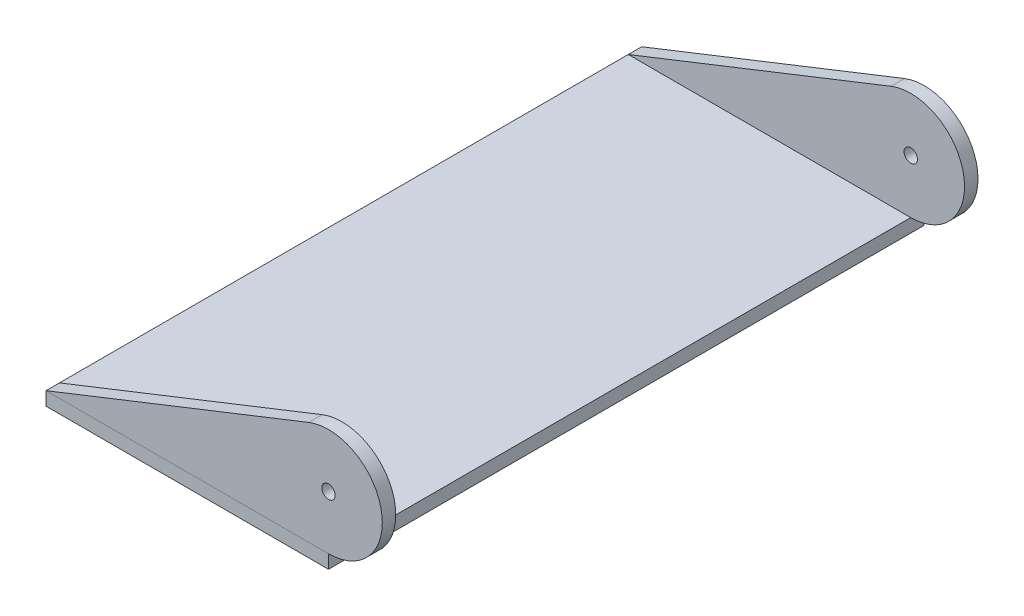
ISO-10303-21;
HEADER;
FILE_DESCRIPTION(('STEP AP214'),'2;1');
FILE_NAME('part.step','',(''),(''),'','','');
FILE_SCHEMA(('AUTOMOTIVE_DESIGN { 1 0 10303 214 1 1 1 1 }'));
ENDSEC;
DATA;
#1=APPLICATION_CONTEXT('core data for automotive mechanical design processes');
#2=APPLICATION_PROTOCOL_DEFINITION('international standard','automotive_design',2000,#1);
#3=PRODUCT_CONTEXT('',#1,'mechanical');
#4=PRODUCT('Part','Part','',(#3));
#5=PRODUCT_RELATED_PRODUCT_CATEGORY('part','',(#4));
#6=PRODUCT_DEFINITION_FORMATION('','',#4);
#7=PRODUCT_DEFINITION_CONTEXT('part definition',#1,'design');
#8=PRODUCT_DEFINITION('design','',#6,#7);
#9=PRODUCT_DEFINITION_SHAPE('','',#8);
#10=(LENGTH_UNIT() NAMED_UNIT(*) SI_UNIT(.MILLI.,.METRE.));
#11=(NAMED_UNIT(*) PLANE_ANGLE_UNIT() SI_UNIT($,.RADIAN.));
#12=(NAMED_UNIT(*) SI_UNIT($,.STERADIAN.) SOLID_ANGLE_UNIT());
#13=UNCERTAINTY_MEASURE_WITH_UNIT(LENGTH_MEASURE(1.E-05),#10,'distance_accuracy_value','');
#14=(GEOMETRIC_REPRESENTATION_CONTEXT(3) GLOBAL_UNCERTAINTY_ASSIGNED_CONTEXT((#13)) GLOBAL_UNIT_ASSIGNED_CONTEXT((#10,
#11,#12)) REPRESENTATION_CONTEXT('',''));
#15=CARTESIAN_POINT('',(0.,0.,0.));
#16=DIRECTION('',(0.,0.,1.));
#17=DIRECTION('',(1.,0.,0.));
#18=AXIS2_PLACEMENT_3D('',#15,#16,#17);
#19=CARTESIAN_POINT('',(0.,1.5875,-42.1947603330405));
#20=DIRECTION('',(0.,1.,0.));
#21=DIRECTION('',(0.,0.,1.));
#22=AXIS2_PLACEMENT_3D('',#19,#20,#21);
#23=PLANE('',#22);
#24=DIRECTION('',(0.,0.,1.));
#25=VECTOR('',#24,1.);
#26=CARTESIAN_POINT('',(32.9217251712329,1.5875,-42.1947603330405));
#27=LINE('',#26,#25);
#28=CARTESIAN_POINT('',(32.9217251712329,1.5875,-0.524775256849318));
#29=VERTEX_POINT('',#28);
#30=CARTESIAN_POINT('',(32.9217251712329,1.5875,1.06272474315068));
#31=VERTEX_POINT('',#30);
#32=EDGE_CURVE('E50',#29,#31,#27,.T.);
#33=ORIENTED_EDGE('',*,*,#32,.T.);
#34=DIRECTION('',(-1.,0.,0.));
#35=VECTOR('',#34,1.);
#36=CARTESIAN_POINT('',(39.2717251712329,1.5875,1.06272474315068));
#37=LINE('',#36,#35);
#38=CARTESIAN_POINT('',(-0.415774828767123,1.5875,1.06272474315068));
#39=VERTEX_POINT('',#38);
#40=EDGE_CURVE('E97',#31,#39,#37,.T.);
#41=ORIENTED_EDGE('',*,*,#40,.T.);
#42=DIRECTION('',(0.,0.,1.));
#43=VECTOR('',#42,1.);
#44=CARTESIAN_POINT('',(-0.415774828767123,1.5875,-42.1947603330405));
#45=LINE('',#44,#43);
#46=CARTESIAN_POINT('',(-0.415774828767123,1.5875,-0.524775256849318));
#47=VERTEX_POINT('',#46);
#48=EDGE_CURVE('E93',#47,#39,#45,.T.);
#49=ORIENTED_EDGE('',*,*,#48,.F.);
#50=DIRECTION('',(-1.,0.,0.));
#51=VECTOR('',#50,1.);
#52=CARTESIAN_POINT('',(0.,1.5875,-0.524775256849318));
#53=LINE('',#52,#51);
#54=EDGE_CURVE('E81',#29,#47,#53,.T.);
#55=ORIENTED_EDGE('',*,*,#54,.F.);
#56=EDGE_LOOP('',(#33,#41,#49,#55));
#57=FACE_BOUND('',#56,.T.);
#58=ADVANCED_FACE('F46',(#57),#23,.F.);
#59=CARTESIAN_POINT('',(-0.59891274924526,1.51510665731688,-42.1947603330405));
#60=DIRECTION('',(0.367614879649891,-0.929978118161926,0.));
#61=DIRECTION('',(0.929978118161926,0.367614879649891,0.));
#62=AXIS2_PLACEMENT_3D('',#59,#60,#61);
#63=PLANE('',#62);
#64=ORIENTED_EDGE('',*,*,#48,.T.);
#65=DIRECTION('',(0.929978118161926,0.367614879649891,0.));
#66=VECTOR('',#65,1.);
#67=CARTESIAN_POINT('',(-0.598912749245261,1.51510665731688,1.06272474315068));
#68=LINE('',#67,#66);
#69=CARTESIAN_POINT('',(30.5873706854561,13.8428610503282,1.06272474315068));
#70=VERTEX_POINT('',#69);
#71=EDGE_CURVE('E62',#39,#70,#68,.T.);
#72=ORIENTED_EDGE('',*,*,#71,.T.);
#73=DIRECTION('',(0.,0.,1.));
#74=VECTOR('',#73,1.);
#75=CARTESIAN_POINT('',(30.5873706854561,13.8428610503282,-42.1947603330405));
#76=LINE('',#75,#74);
#77=CARTESIAN_POINT('',(30.5873706854561,13.8428610503282,-0.524775256849318));
#78=VERTEX_POINT('',#77);
#79=EDGE_CURVE('E88',#78,#70,#76,.T.);
#80=ORIENTED_EDGE('',*,*,#79,.F.);
#81=DIRECTION('',(0.929978118161926,0.367614879649891,0.));
#82=VECTOR('',#81,1.);
#83=CARTESIAN_POINT('',(-0.59891274924526,1.51510665731688,-0.524775256849318));
#84=LINE('',#83,#82);
#85=EDGE_CURVE('E55',#47,#78,#84,.T.);
#86=ORIENTED_EDGE('',*,*,#85,.F.);
#87=EDGE_LOOP('',(#64,#72,#80,#86));
#88=FACE_BOUND('',#87,.T.);
#89=ADVANCED_FACE('F110',(#88),#63,.F.);
#90=CARTESIAN_POINT('',(32.9217251712329,7.9375,-42.1947603330405));
#91=DIRECTION('',(0.,0.,1.));
#92=DIRECTION('',(1.,0.,0.));
#93=AXIS2_PLACEMENT_3D('',#90,#91,#92);
#94=CYLINDRICAL_SURFACE('',#93,6.35);
#95=CARTESIAN_POINT('',(32.9217251712329,7.9375,1.06272474315068));
#96=DIRECTION('',(0.,0.,-1.));
#97=DIRECTION('',(0.,1.,0.));
#98=AXIS2_PLACEMENT_3D('',#95,#96,#97);
#99=CIRCLE('',#98,6.35);
#100=EDGE_CURVE('E12',#31,#70,#99,.F.);
#101=ORIENTED_EDGE('',*,*,#100,.F.);
#102=ORIENTED_EDGE('',*,*,#32,.F.);
#103=CARTESIAN_POINT('',(32.9217251712329,7.9375,-0.524775256849318));
#104=DIRECTION('',(0.,0.,-1.));
#105=DIRECTION('',(-1.,0.,0.));
#106=AXIS2_PLACEMENT_3D('',#103,#104,#105);
#107=CIRCLE('',#106,6.35);
#108=EDGE_CURVE('E78',#29,#78,#107,.F.);
#109=ORIENTED_EDGE('',*,*,#108,.T.);
#110=ORIENTED_EDGE('',*,*,#79,.T.);
#111=EDGE_LOOP('',(#101,#102,#109,#110));
#112=FACE_BOUND('',#111,.T.);
#113=ADVANCED_FACE('F96',(#112),#94,.T.);
#114=CARTESIAN_POINT('',(32.9217251712329,7.9375,-42.1947603330405));
#115=DIRECTION('',(0.,0.,1.));
#116=DIRECTION('',(1.,0.,0.));
#117=AXIS2_PLACEMENT_3D('',#114,#115,#116);
#118=CYLINDRICAL_SURFACE('',#117,0.79375);
#119=CARTESIAN_POINT('',(32.9217251712329,7.9375,1.06272474315068));
#120=DIRECTION('',(0.,0.,-1.));
#121=DIRECTION('',(0.,1.,0.));
#122=AXIS2_PLACEMENT_3D('',#119,#120,#121);
#123=CIRCLE('',#122,0.79375);
#124=CARTESIAN_POINT('',(32.9217251712329,8.73125,1.06272474315068));
#125=VERTEX_POINT('',#124);
#126=EDGE_CURVE('E101',#125,#125,#123,.F.);
#127=ORIENTED_EDGE('',*,*,#126,.T.);
#128=EDGE_LOOP('',(#127));
#129=FACE_BOUND('',#128,.T.);
#130=CARTESIAN_POINT('',(32.9217251712329,7.9375,-0.524775256849318));
#131=DIRECTION('',(0.,0.,-1.));
#132=DIRECTION('',(-1.,0.,0.));
#133=AXIS2_PLACEMENT_3D('',#130,#131,#132);
#134=CIRCLE('',#133,0.79375);
#135=CARTESIAN_POINT('',(32.1279751712329,7.9375,-0.524775256849318));
#136=VERTEX_POINT('',#135);
#137=EDGE_CURVE('E94',#136,#136,#134,.F.);
#138=ORIENTED_EDGE('',*,*,#137,.F.);
#139=EDGE_LOOP('',(#138));
#140=FACE_BOUND('',#139,.T.);
#141=ADVANCED_FACE('F48',(#129,#140),#118,.F.);
#142=CARTESIAN_POINT('',(-0.415774828767123,1.5875,-0.524775256849315));
#143=DIRECTION('',(0.,0.,-1.));
#144=DIRECTION('',(-1.,0.,0.));
#145=AXIS2_PLACEMENT_3D('',#142,#143,#144);
#146=PLANE('',#145);
#147=ORIENTED_EDGE('',*,*,#137,.T.);
#148=EDGE_LOOP('',(#147));
#149=FACE_BOUND('',#148,.T.);
#150=ORIENTED_EDGE('',*,*,#108,.F.);
#151=ORIENTED_EDGE('',*,*,#54,.T.);
#152=ORIENTED_EDGE('',*,*,#85,.T.);
#153=EDGE_LOOP('',(#150,#151,#152));
#154=FACE_BOUND('',#153,.T.);
#155=ADVANCED_FACE('F80',(#149,#154),#146,.T.);
#156=CARTESIAN_POINT('',(39.2717251712329,1.5875,1.06272474315068));
#157=DIRECTION('',(0.,0.,-1.));
#158=DIRECTION('',(0.,1.,0.));
#159=AXIS2_PLACEMENT_3D('',#156,#157,#158);
#160=PLANE('',#159);
#161=ORIENTED_EDGE('',*,*,#126,.F.);
#162=EDGE_LOOP('',(#161));
#163=FACE_BOUND('',#162,.T.);
#164=ORIENTED_EDGE('',*,*,#40,.F.);
#165=ORIENTED_EDGE('',*,*,#100,.T.);
#166=ORIENTED_EDGE('',*,*,#71,.F.);
#167=EDGE_LOOP('',(#164,#165,#166));
#168=FACE_BOUND('',#167,.T.);
#169=ADVANCED_FACE('F119',(#163,#168),#160,.F.);
#170=CLOSED_SHELL('',(#58,#89,#113,#141,#155,#169));
#171=MANIFOLD_SOLID_BREP('B2',#170);
#172=CARTESIAN_POINT('',(32.9217251712329,7.9375,-42.1947603330405));
#173=DIRECTION('',(0.,0.,1.));
#174=DIRECTION('',(1.,0.,0.));
#175=AXIS2_PLACEMENT_3D('',#172,#173,#174);
#176=CYLINDRICAL_SURFACE('',#175,6.35);
#177=CARTESIAN_POINT('',(32.9217251712329,7.9375,68.1877247431507));
#178=DIRECTION('',(0.,0.,1.));
#179=DIRECTION('',(1.,0.,0.));
#180=AXIS2_PLACEMENT_3D('',#177,#178,#179);
#181=CIRCLE('',#180,6.35);
#182=CARTESIAN_POINT('',(30.5873706854561,13.8428610503282,68.1877247431507));
#183=VERTEX_POINT('',#182);
#184=CARTESIAN_POINT('',(32.9217251712329,1.5875,68.1877247431507));
#185=VERTEX_POINT('',#184);
#186=EDGE_CURVE('E214',#183,#185,#181,.F.);
#187=ORIENTED_EDGE('',*,*,#186,.F.);
#188=DIRECTION('',(0.,0.,1.));
#189=VECTOR('',#188,1.);
#190=CARTESIAN_POINT('',(30.5873706854561,13.8428610503282,-42.1947603330405));
#191=LINE('',#190,#189);
#192=CARTESIAN_POINT('',(30.5873706854561,13.8428610503282,69.7752247431507));
#193=VERTEX_POINT('',#192);
#194=EDGE_CURVE('E195',#183,#193,#191,.T.);
#195=ORIENTED_EDGE('',*,*,#194,.T.);
#196=CARTESIAN_POINT('',(32.9217251712329,7.9375,69.7752247431507));
#197=DIRECTION('',(0.,0.,1.));
#198=DIRECTION('',(1.,0.,0.));
#199=AXIS2_PLACEMENT_3D('',#196,#197,#198);
#200=CIRCLE('',#199,6.35);
#201=CARTESIAN_POINT('',(32.9217251712329,1.5875,69.7752247431507));
#202=VERTEX_POINT('',#201);
#203=EDGE_CURVE('E44',#202,#193,#200,.T.);
#204=ORIENTED_EDGE('',*,*,#203,.F.);
#205=DIRECTION('',(0.,0.,1.));
#206=VECTOR('',#205,1.);
#207=CARTESIAN_POINT('',(32.9217251712329,1.5875,-42.1947603330405));
#208=LINE('',#207,#206);
#209=EDGE_CURVE('E224',#185,#202,#208,.T.);
#210=ORIENTED_EDGE('',*,*,#209,.F.);
#211=EDGE_LOOP('',(#187,#195,#204,#210));
#212=FACE_BOUND('',#211,.T.);
#213=ADVANCED_FACE('F177',(#212),#176,.T.);
#214=CARTESIAN_POINT('',(-0.59891274924526,1.51510665731688,-42.1947603330405));
#215=DIRECTION('',(0.367614879649891,-0.929978118161926,0.));
#216=DIRECTION('',(0.929978118161926,0.367614879649891,0.));
#217=AXIS2_PLACEMENT_3D('',#214,#215,#216);
#218=PLANE('',#217);
#219=ORIENTED_EDGE('',*,*,#194,.F.);
#220=DIRECTION('',(-0.929978118161926,-0.367614879649891,0.));
#221=VECTOR('',#220,1.);
#222=CARTESIAN_POINT('',(-0.59891274924526,1.51510665731688,68.1877247431507));
#223=LINE('',#222,#221);
#224=CARTESIAN_POINT('',(-0.415774828767123,1.5875,68.1877247431507));
#225=VERTEX_POINT('',#224);
#226=EDGE_CURVE('E213',#183,#225,#223,.T.);
#227=ORIENTED_EDGE('',*,*,#226,.T.);
#228=DIRECTION('',(0.,0.,1.));
#229=VECTOR('',#228,1.);
#230=CARTESIAN_POINT('',(-0.415774828767123,1.5875,-42.1947603330405));
#231=LINE('',#230,#229);
#232=CARTESIAN_POINT('',(-0.415774828767123,1.5875,69.7752247431507));
#233=VERTEX_POINT('',#232);
#234=EDGE_CURVE('E222',#225,#233,#231,.T.);
#235=ORIENTED_EDGE('',*,*,#234,.T.);
#236=DIRECTION('',(0.929978118161926,0.367614879649891,0.));
#237=VECTOR('',#236,1.);
#238=CARTESIAN_POINT('',(-0.59891274924526,1.51510665731688,69.7752247431507));
#239=LINE('',#238,#237);
#240=EDGE_CURVE('E230',#233,#193,#239,.T.);
#241=ORIENTED_EDGE('',*,*,#240,.T.);
#242=EDGE_LOOP('',(#219,#227,#235,#241));
#243=FACE_BOUND('',#242,.T.);
#244=ADVANCED_FACE('F221',(#243),#218,.F.);
#245=CARTESIAN_POINT('',(0.,1.5875,-42.1947603330405));
#246=DIRECTION('',(0.,1.,0.));
#247=DIRECTION('',(0.,0.,1.));
#248=AXIS2_PLACEMENT_3D('',#245,#246,#247);
#249=PLANE('',#248);
#250=ORIENTED_EDGE('',*,*,#234,.F.);
#251=DIRECTION('',(-1.,0.,0.));
#252=VECTOR('',#251,1.);
#253=CARTESIAN_POINT('',(39.2717251712329,1.5875,68.1877247431507));
#254=LINE('',#253,#252);
#255=EDGE_CURVE('E210',#185,#225,#254,.T.);
#256=ORIENTED_EDGE('',*,*,#255,.F.);
#257=ORIENTED_EDGE('',*,*,#209,.T.);
#258=DIRECTION('',(-1.,0.,0.));
#259=VECTOR('',#258,1.);
#260=CARTESIAN_POINT('',(0.,1.5875,69.7752247431507));
#261=LINE('',#260,#259);
#262=EDGE_CURVE('E229',#202,#233,#261,.T.);
#263=ORIENTED_EDGE('',*,*,#262,.T.);
#264=EDGE_LOOP('',(#250,#256,#257,#263));
#265=FACE_BOUND('',#264,.T.);
#266=ADVANCED_FACE('F227',(#265),#249,.F.);
#267=CARTESIAN_POINT('',(0.,0.,69.7752247431507));
#268=DIRECTION('',(0.,0.,1.));
#269=DIRECTION('',(1.,0.,0.));
#270=AXIS2_PLACEMENT_3D('',#267,#268,#269);
#271=PLANE('',#270);
#272=ORIENTED_EDGE('',*,*,#262,.F.);
#273=ORIENTED_EDGE('',*,*,#203,.T.);
#274=ORIENTED_EDGE('',*,*,#240,.F.);
#275=EDGE_LOOP('',(#272,#273,#274));
#276=FACE_BOUND('',#275,.T.);
#277=CARTESIAN_POINT('',(32.9217251712329,7.9375,69.7752247431507));
#278=DIRECTION('',(0.,0.,1.));
#279=DIRECTION('',(1.,0.,0.));
#280=AXIS2_PLACEMENT_3D('',#277,#278,#279);
#281=CIRCLE('',#280,0.79375);
#282=CARTESIAN_POINT('',(33.7154751712329,7.9375,69.7752247431507));
#283=VERTEX_POINT('',#282);
#284=EDGE_CURVE('E187',#283,#283,#281,.T.);
#285=ORIENTED_EDGE('',*,*,#284,.F.);
#286=EDGE_LOOP('',(#285));
#287=FACE_BOUND('',#286,.T.);
#288=ADVANCED_FACE('F236',(#276,#287),#271,.T.);
#289=CARTESIAN_POINT('',(32.9217251712329,7.9375,-42.1947603330405));
#290=DIRECTION('',(0.,0.,1.));
#291=DIRECTION('',(1.,0.,0.));
#292=AXIS2_PLACEMENT_3D('',#289,#290,#291);
#293=CYLINDRICAL_SURFACE('',#292,0.79375);
#294=CARTESIAN_POINT('',(32.9217251712329,7.9375,68.1877247431507));
#295=DIRECTION('',(0.,0.,1.));
#296=DIRECTION('',(1.,0.,0.));
#297=AXIS2_PLACEMENT_3D('',#294,#295,#296);
#298=CIRCLE('',#297,0.79375);
#299=CARTESIAN_POINT('',(33.7154751712329,7.9375,68.1877247431507));
#300=VERTEX_POINT('',#299);
#301=EDGE_CURVE('E181',#300,#300,#298,.F.);
#302=ORIENTED_EDGE('',*,*,#301,.T.);
#303=EDGE_LOOP('',(#302));
#304=FACE_BOUND('',#303,.T.);
#305=ORIENTED_EDGE('',*,*,#284,.T.);
#306=EDGE_LOOP('',(#305));
#307=FACE_BOUND('',#306,.T.);
#308=ADVANCED_FACE('F179',(#304,#307),#293,.F.);
#309=CARTESIAN_POINT('',(39.2717251712329,1.5875,68.1877247431507));
#310=DIRECTION('',(0.,0.,1.));
#311=DIRECTION('',(1.,0.,0.));
#312=AXIS2_PLACEMENT_3D('',#309,#310,#311);
#313=PLANE('',#312);
#314=ORIENTED_EDGE('',*,*,#301,.F.);
#315=EDGE_LOOP('',(#314));
#316=FACE_BOUND('',#315,.T.);
#317=ORIENTED_EDGE('',*,*,#226,.F.);
#318=ORIENTED_EDGE('',*,*,#186,.T.);
#319=ORIENTED_EDGE('',*,*,#255,.T.);
#320=EDGE_LOOP('',(#317,#318,#319));
#321=FACE_BOUND('',#320,.T.);
#322=ADVANCED_FACE('F212',(#316,#321),#313,.F.);
#323=CLOSED_SHELL('',(#213,#244,#266,#288,#308,#322));
#324=MANIFOLD_SOLID_BREP('B6',#323);
#325=CARTESIAN_POINT('',(-0.415774828767123,1.5875,69.7752247431507));
#326=DIRECTION('',(-1.,0.,0.));
#327=DIRECTION('',(0.,0.,1.));
#328=AXIS2_PLACEMENT_3D('',#325,#326,#327);
#329=PLANE('',#328);
#330=DIRECTION('',(0.,0.,-1.));
#331=VECTOR('',#330,1.);
#332=CARTESIAN_POINT('',(-0.415774828767123,0.,69.7752247431507));
#333=LINE('',#332,#331);
#334=CARTESIAN_POINT('',(-0.415774828767123,0.,69.7752247431507));
#335=VERTEX_POINT('',#334);
#336=CARTESIAN_POINT('',(-0.415774828767123,0.,-0.524775256849315));
#337=VERTEX_POINT('',#336);
#338=EDGE_CURVE('E367',#335,#337,#333,.T.);
#339=ORIENTED_EDGE('',*,*,#338,.F.);
#340=DIRECTION('',(0.,-1.,0.));
#341=VECTOR('',#340,1.);
#342=CARTESIAN_POINT('',(-0.415774828767123,1.5875,69.7752247431507));
#343=LINE('',#342,#341);
#344=CARTESIAN_POINT('',(-0.415774828767123,1.5875,69.7752247431507));
#345=VERTEX_POINT('',#344);
#346=EDGE_CURVE('E175',#345,#335,#343,.T.);
#347=ORIENTED_EDGE('',*,*,#346,.F.);
#348=DIRECTION('',(0.,0.,-1.));
#349=VECTOR('',#348,1.);
#350=CARTESIAN_POINT('',(-0.415774828767123,1.5875,69.7752247431507));
#351=LINE('',#350,#349);
#352=CARTESIAN_POINT('',(-0.415774828767123,1.5875,-0.524775256849315));
#353=VERTEX_POINT('',#352);
#354=EDGE_CURVE('E362',#345,#353,#351,.T.);
#355=ORIENTED_EDGE('',*,*,#354,.T.);
#356=DIRECTION('',(0.,-1.,0.));
#357=VECTOR('',#356,1.);
#358=CARTESIAN_POINT('',(-0.415774828767123,1.5875,-0.524775256849315));
#359=LINE('',#358,#357);
#360=EDGE_CURVE('E305',#353,#337,#359,.T.);
#361=ORIENTED_EDGE('',*,*,#360,.T.);
#362=EDGE_LOOP('',(#339,#347,#355,#361));
#363=FACE_BOUND('',#362,.T.);
#364=ADVANCED_FACE('F302',(#363),#329,.T.);
#365=CARTESIAN_POINT('',(-0.415774828767123,1.5875,69.7752247431507));
#366=DIRECTION('',(0.,0.,-1.));
#367=DIRECTION('',(-1.,0.,0.));
#368=AXIS2_PLACEMENT_3D('',#365,#366,#367);
#369=PLANE('',#368);
#370=DIRECTION('',(1.,0.,0.));
#371=VECTOR('',#370,1.);
#372=CARTESIAN_POINT('',(-0.415774828767123,0.,69.7752247431507));
#373=LINE('',#372,#371);
#374=CARTESIAN_POINT('',(32.9217251712329,0.,69.7752247431507));
#375=VERTEX_POINT('',#374);
#376=EDGE_CURVE('E335',#335,#375,#373,.T.);
#377=ORIENTED_EDGE('',*,*,#376,.T.);
#378=DIRECTION('',(0.,-1.,0.));
#379=VECTOR('',#378,1.);
#380=CARTESIAN_POINT('',(32.9217251712329,1.5875,69.7752247431507));
#381=LINE('',#380,#379);
#382=CARTESIAN_POINT('',(32.9217251712329,1.5875,69.7752247431507));
#383=VERTEX_POINT('',#382);
#384=EDGE_CURVE('E311',#383,#375,#381,.T.);
#385=ORIENTED_EDGE('',*,*,#384,.F.);
#386=DIRECTION('',(1.,0.,0.));
#387=VECTOR('',#386,1.);
#388=CARTESIAN_POINT('',(-0.415774828767123,1.5875,69.7752247431507));
#389=LINE('',#388,#387);
#390=EDGE_CURVE('E352',#345,#383,#389,.T.);
#391=ORIENTED_EDGE('',*,*,#390,.F.);
#392=ORIENTED_EDGE('',*,*,#346,.T.);
#393=EDGE_LOOP('',(#377,#385,#391,#392));
#394=FACE_BOUND('',#393,.T.);
#395=ADVANCED_FACE('F377',(#394),#369,.F.);
#396=CARTESIAN_POINT('',(32.9217251712329,1.5875,69.7752247431507));
#397=DIRECTION('',(-1.,0.,0.));
#398=DIRECTION('',(0.,0.,1.));
#399=AXIS2_PLACEMENT_3D('',#396,#397,#398);
#400=PLANE('',#399);
#401=DIRECTION('',(0.,0.,-1.));
#402=VECTOR('',#401,1.);
#403=CARTESIAN_POINT('',(32.9217251712329,0.,69.7752247431507));
#404=LINE('',#403,#402);
#405=CARTESIAN_POINT('',(32.9217251712329,0.,-0.524775256849315));
#406=VERTEX_POINT('',#405);
#407=EDGE_CURVE('E359',#375,#406,#404,.T.);
#408=ORIENTED_EDGE('',*,*,#407,.T.);
#409=DIRECTION('',(0.,-1.,0.));
#410=VECTOR('',#409,1.);
#411=CARTESIAN_POINT('',(32.9217251712329,1.5875,-0.524775256849315));
#412=LINE('',#411,#410);
#413=CARTESIAN_POINT('',(32.9217251712329,1.5875,-0.524775256849315));
#414=VERTEX_POINT('',#413);
#415=EDGE_CURVE('E356',#414,#406,#412,.T.);
#416=ORIENTED_EDGE('',*,*,#415,.F.);
#417=DIRECTION('',(0.,0.,-1.));
#418=VECTOR('',#417,1.);
#419=CARTESIAN_POINT('',(32.9217251712329,1.5875,69.7752247431507));
#420=LINE('',#419,#418);
#421=EDGE_CURVE('E347',#383,#414,#420,.T.);
#422=ORIENTED_EDGE('',*,*,#421,.F.);
#423=ORIENTED_EDGE('',*,*,#384,.T.);
#424=EDGE_LOOP('',(#408,#416,#422,#423));
#425=FACE_BOUND('',#424,.T.);
#426=ADVANCED_FACE('F357',(#425),#400,.F.);
#427=CARTESIAN_POINT('',(-0.415774828767123,1.5875,-0.524775256849315));
#428=DIRECTION('',(0.,0.,-1.));
#429=DIRECTION('',(-1.,0.,0.));
#430=AXIS2_PLACEMENT_3D('',#427,#428,#429);
#431=PLANE('',#430);
#432=DIRECTION('',(1.,0.,0.));
#433=VECTOR('',#432,1.);
#434=CARTESIAN_POINT('',(-0.415774828767123,0.,-0.524775256849315));
#435=LINE('',#434,#433);
#436=EDGE_CURVE('E370',#337,#406,#435,.T.);
#437=ORIENTED_EDGE('',*,*,#436,.F.);
#438=ORIENTED_EDGE('',*,*,#360,.F.);
#439=DIRECTION('',(1.,0.,0.));
#440=VECTOR('',#439,1.);
#441=CARTESIAN_POINT('',(-0.415774828767123,1.5875,-0.524775256849315));
#442=LINE('',#441,#440);
#443=EDGE_CURVE('E351',#353,#414,#442,.T.);
#444=ORIENTED_EDGE('',*,*,#443,.T.);
#445=ORIENTED_EDGE('',*,*,#415,.T.);
#446=EDGE_LOOP('',(#437,#438,#444,#445));
#447=FACE_BOUND('',#446,.T.);
#448=ADVANCED_FACE('F361',(#447),#431,.T.);
#449=CARTESIAN_POINT('',(0.,1.5875,0.));
#450=DIRECTION('',(0.,-1.,0.));
#451=DIRECTION('',(0.,0.,-1.));
#452=AXIS2_PLACEMENT_3D('',#449,#450,#451);
#453=PLANE('',#452);
#454=ORIENTED_EDGE('',*,*,#354,.F.);
#455=ORIENTED_EDGE('',*,*,#390,.T.);
#456=ORIENTED_EDGE('',*,*,#421,.T.);
#457=ORIENTED_EDGE('',*,*,#443,.F.);
#458=EDGE_LOOP('',(#454,#455,#456,#457));
#459=FACE_BOUND('',#458,.T.);
#460=ADVANCED_FACE('F350',(#459),#453,.F.);
#461=CARTESIAN_POINT('',(0.,0.,0.));
#462=DIRECTION('',(0.,-1.,0.));
#463=DIRECTION('',(0.,0.,-1.));
#464=AXIS2_PLACEMENT_3D('',#461,#462,#463);
#465=PLANE('',#464);
#466=ORIENTED_EDGE('',*,*,#338,.T.);
#467=ORIENTED_EDGE('',*,*,#436,.T.);
#468=ORIENTED_EDGE('',*,*,#407,.F.);
#469=ORIENTED_EDGE('',*,*,#376,.F.);
#470=EDGE_LOOP('',(#466,#467,#468,#469));
#471=FACE_BOUND('',#470,.T.);
#472=ADVANCED_FACE('F375',(#471),#465,.T.);
#473=CLOSED_SHELL('',(#364,#395,#426,#448,#460,#472));
#474=MANIFOLD_SOLID_BREP('B38',#473);
#475=ADVANCED_BREP_SHAPE_REPRESENTATION('',(#18,#171,#324,#474),#14);
#476=SHAPE_DEFINITION_REPRESENTATION(#9,#475);
ENDSEC;
END-ISO-10303-21;
